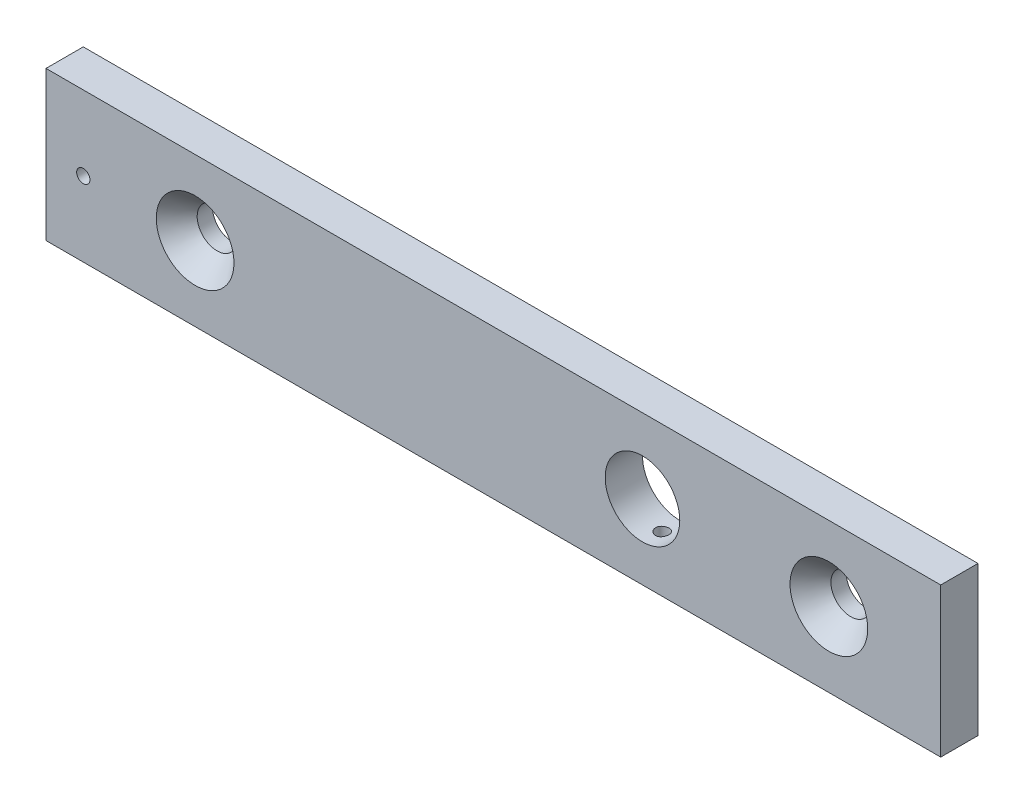
ISO-10303-21;
HEADER;
FILE_DESCRIPTION(('STEP AP214'),'2;1');
FILE_NAME('part.step','',(''),(''),'','','');
FILE_SCHEMA(('AUTOMOTIVE_DESIGN { 1 0 10303 214 1 1 1 1 }'));
ENDSEC;
DATA;
#1=APPLICATION_CONTEXT('core data for automotive mechanical design processes');
#2=APPLICATION_PROTOCOL_DEFINITION('international standard','automotive_design',2000,#1);
#3=PRODUCT_CONTEXT('',#1,'mechanical');
#4=PRODUCT('Part','Part','',(#3));
#5=PRODUCT_RELATED_PRODUCT_CATEGORY('part','',(#4));
#6=PRODUCT_DEFINITION_FORMATION('','',#4);
#7=PRODUCT_DEFINITION_CONTEXT('part definition',#1,'design');
#8=PRODUCT_DEFINITION('design','',#6,#7);
#9=PRODUCT_DEFINITION_SHAPE('','',#8);
#10=(LENGTH_UNIT() NAMED_UNIT(*) SI_UNIT(.MILLI.,.METRE.));
#11=(NAMED_UNIT(*) PLANE_ANGLE_UNIT() SI_UNIT($,.RADIAN.));
#12=(NAMED_UNIT(*) SI_UNIT($,.STERADIAN.) SOLID_ANGLE_UNIT());
#13=UNCERTAINTY_MEASURE_WITH_UNIT(LENGTH_MEASURE(1.E-05),#10,'distance_accuracy_value','');
#14=(GEOMETRIC_REPRESENTATION_CONTEXT(3) GLOBAL_UNCERTAINTY_ASSIGNED_CONTEXT((#13)) GLOBAL_UNIT_ASSIGNED_CONTEXT((#10,
#11,#12)) REPRESENTATION_CONTEXT('',''));
#15=CARTESIAN_POINT('',(0.,0.,0.));
#16=DIRECTION('',(0.,0.,1.));
#17=DIRECTION('',(1.,0.,0.));
#18=AXIS2_PLACEMENT_3D('',#15,#16,#17);
#19=CARTESIAN_POINT('',(-76.2,12.7,6.35));
#20=DIRECTION('',(1.,0.,0.));
#21=DIRECTION('',(0.,0.,-1.));
#22=AXIS2_PLACEMENT_3D('',#19,#20,#21);
#23=PLANE('',#22);
#24=DIRECTION('',(0.,-1.,0.));
#25=VECTOR('',#24,1.);
#26=CARTESIAN_POINT('',(-76.2,12.7,0.));
#27=LINE('',#26,#25);
#28=CARTESIAN_POINT('',(-76.2,12.7,0.));
#29=VERTEX_POINT('',#28);
#30=CARTESIAN_POINT('',(-76.2,-12.7,0.));
#31=VERTEX_POINT('',#30);
#32=EDGE_CURVE('E99',#29,#31,#27,.T.);
#33=ORIENTED_EDGE('',*,*,#32,.T.);
#34=DIRECTION('',(0.,0.,-1.));
#35=VECTOR('',#34,1.);
#36=CARTESIAN_POINT('',(-76.2,-12.7,6.35));
#37=LINE('',#36,#35);
#38=CARTESIAN_POINT('',(-76.2,-12.7,6.35));
#39=VERTEX_POINT('',#38);
#40=EDGE_CURVE('E11',#39,#31,#37,.T.);
#41=ORIENTED_EDGE('',*,*,#40,.F.);
#42=DIRECTION('',(0.,-1.,0.));
#43=VECTOR('',#42,1.);
#44=CARTESIAN_POINT('',(-76.2,12.7,6.35));
#45=LINE('',#44,#43);
#46=CARTESIAN_POINT('',(-76.2,12.7,6.35));
#47=VERTEX_POINT('',#46);
#48=EDGE_CURVE('E110',#47,#39,#45,.T.);
#49=ORIENTED_EDGE('',*,*,#48,.F.);
#50=DIRECTION('',(0.,0.,-1.));
#51=VECTOR('',#50,1.);
#52=CARTESIAN_POINT('',(-76.2,12.7,6.35));
#53=LINE('',#52,#51);
#54=EDGE_CURVE('E115',#47,#29,#53,.T.);
#55=ORIENTED_EDGE('',*,*,#54,.T.);
#56=EDGE_LOOP('',(#33,#41,#49,#55));
#57=FACE_BOUND('',#56,.T.);
#58=ADVANCED_FACE('F33',(#57),#23,.F.);
#59=CARTESIAN_POINT('',(-76.2,-12.7,6.35));
#60=DIRECTION('',(0.,1.,0.));
#61=DIRECTION('',(0.,0.,1.));
#62=AXIS2_PLACEMENT_3D('',#59,#60,#61);
#63=PLANE('',#62);
#64=CARTESIAN_POINT('',(25.6106696622072,-12.7,3.17891845136241));
#65=DIRECTION('',(0.,-1.,0.));
#66=DIRECTION('',(0.,0.,-1.));
#67=AXIS2_PLACEMENT_3D('',#64,#65,#66);
#68=CIRCLE('',#67,1.13029999999999);
#69=CARTESIAN_POINT('',(25.6106696622072,-12.7,2.04861845136242));
#70=VERTEX_POINT('',#69);
#71=EDGE_CURVE('E152',#70,#70,#68,.T.);
#72=ORIENTED_EDGE('',*,*,#71,.F.);
#73=EDGE_LOOP('',(#72));
#74=FACE_BOUND('',#73,.T.);
#75=DIRECTION('',(1.,0.,0.));
#76=VECTOR('',#75,1.);
#77=CARTESIAN_POINT('',(-76.2,-12.7,0.));
#78=LINE('',#77,#76);
#79=CARTESIAN_POINT('',(76.2,-12.7,0.));
#80=VERTEX_POINT('',#79);
#81=EDGE_CURVE('E103',#31,#80,#78,.T.);
#82=ORIENTED_EDGE('',*,*,#81,.T.);
#83=DIRECTION('',(0.,0.,-1.));
#84=VECTOR('',#83,1.);
#85=CARTESIAN_POINT('',(76.2,-12.7,6.35));
#86=LINE('',#85,#84);
#87=CARTESIAN_POINT('',(76.2,-12.7,6.35));
#88=VERTEX_POINT('',#87);
#89=EDGE_CURVE('E46',#88,#80,#86,.T.);
#90=ORIENTED_EDGE('',*,*,#89,.F.);
#91=DIRECTION('',(1.,0.,0.));
#92=VECTOR('',#91,1.);
#93=CARTESIAN_POINT('',(-76.2,-12.7,6.35));
#94=LINE('',#93,#92);
#95=EDGE_CURVE('E85',#39,#88,#94,.T.);
#96=ORIENTED_EDGE('',*,*,#95,.F.);
#97=ORIENTED_EDGE('',*,*,#40,.T.);
#98=EDGE_LOOP('',(#82,#90,#96,#97));
#99=FACE_BOUND('',#98,.T.);
#100=ADVANCED_FACE('F140',(#74,#99),#63,.F.);
#101=CARTESIAN_POINT('',(76.2,12.7,6.35));
#102=DIRECTION('',(-1.,0.,0.));
#103=DIRECTION('',(0.,0.,1.));
#104=AXIS2_PLACEMENT_3D('',#101,#102,#103);
#105=PLANE('',#104);
#106=DIRECTION('',(0.,1.,0.));
#107=VECTOR('',#106,1.);
#108=CARTESIAN_POINT('',(76.2,12.7,0.));
#109=LINE('',#108,#107);
#110=CARTESIAN_POINT('',(76.2,12.7,0.));
#111=VERTEX_POINT('',#110);
#112=EDGE_CURVE('E72',#80,#111,#109,.T.);
#113=ORIENTED_EDGE('',*,*,#112,.T.);
#114=DIRECTION('',(0.,0.,-1.));
#115=VECTOR('',#114,1.);
#116=CARTESIAN_POINT('',(76.2,12.7,6.35));
#117=LINE('',#116,#115);
#118=CARTESIAN_POINT('',(76.2,12.7,6.35));
#119=VERTEX_POINT('',#118);
#120=EDGE_CURVE('E121',#119,#111,#117,.T.);
#121=ORIENTED_EDGE('',*,*,#120,.F.);
#122=DIRECTION('',(0.,1.,0.));
#123=VECTOR('',#122,1.);
#124=CARTESIAN_POINT('',(76.2,12.7,6.35));
#125=LINE('',#124,#123);
#126=EDGE_CURVE('E113',#88,#119,#125,.T.);
#127=ORIENTED_EDGE('',*,*,#126,.F.);
#128=ORIENTED_EDGE('',*,*,#89,.T.);
#129=EDGE_LOOP('',(#113,#121,#127,#128));
#130=FACE_BOUND('',#129,.T.);
#131=ADVANCED_FACE('F124',(#130),#105,.F.);
#132=CARTESIAN_POINT('',(-76.2,12.7,6.35));
#133=DIRECTION('',(0.,-1.,0.));
#134=DIRECTION('',(0.,0.,-1.));
#135=AXIS2_PLACEMENT_3D('',#132,#133,#134);
#136=PLANE('',#135);
#137=DIRECTION('',(-1.,0.,0.));
#138=VECTOR('',#137,1.);
#139=CARTESIAN_POINT('',(-76.2,12.7,0.));
#140=LINE('',#139,#138);
#141=EDGE_CURVE('E78',#111,#29,#140,.T.);
#142=ORIENTED_EDGE('',*,*,#141,.T.);
#143=ORIENTED_EDGE('',*,*,#54,.F.);
#144=DIRECTION('',(-1.,0.,0.));
#145=VECTOR('',#144,1.);
#146=CARTESIAN_POINT('',(-76.2,12.7,6.35));
#147=LINE('',#146,#145);
#148=EDGE_CURVE('E54',#119,#47,#147,.T.);
#149=ORIENTED_EDGE('',*,*,#148,.F.);
#150=ORIENTED_EDGE('',*,*,#120,.T.);
#151=EDGE_LOOP('',(#142,#143,#149,#150));
#152=FACE_BOUND('',#151,.T.);
#153=ADVANCED_FACE('F130',(#152),#136,.F.);
#154=CARTESIAN_POINT('',(-76.2,-12.7,6.35));
#155=DIRECTION('',(0.,0.,1.));
#156=DIRECTION('',(1.,0.,0.));
#157=AXIS2_PLACEMENT_3D('',#154,#155,#156);
#158=PLANE('',#157);
#159=CARTESIAN_POINT('',(57.15,0.,6.35));
#160=DIRECTION('',(0.,0.,1.));
#161=DIRECTION('',(1.,0.,0.));
#162=AXIS2_PLACEMENT_3D('',#159,#160,#161);
#163=CIRCLE('',#162,6.61924);
#164=CARTESIAN_POINT('',(63.76924,0.,6.35));
#165=VERTEX_POINT('',#164);
#166=EDGE_CURVE('E209',#165,#165,#163,.T.);
#167=ORIENTED_EDGE('',*,*,#166,.F.);
#168=EDGE_LOOP('',(#167));
#169=FACE_BOUND('',#168,.T.);
#170=CARTESIAN_POINT('',(-50.8,0.,6.35));
#171=DIRECTION('',(0.,0.,1.));
#172=DIRECTION('',(1.,0.,0.));
#173=AXIS2_PLACEMENT_3D('',#170,#171,#172);
#174=CIRCLE('',#173,6.61924);
#175=CARTESIAN_POINT('',(-44.18076,0.,6.35));
#176=VERTEX_POINT('',#175);
#177=EDGE_CURVE('E201',#176,#176,#174,.T.);
#178=ORIENTED_EDGE('',*,*,#177,.F.);
#179=EDGE_LOOP('',(#178));
#180=FACE_BOUND('',#179,.T.);
#181=CARTESIAN_POINT('',(25.4,0.,6.35));
#182=DIRECTION('',(0.,0.,1.));
#183=DIRECTION('',(1.,0.,0.));
#184=AXIS2_PLACEMENT_3D('',#181,#182,#183);
#185=CIRCLE('',#184,6.34999999999999);
#186=CARTESIAN_POINT('',(31.75,0.,6.35));
#187=VERTEX_POINT('',#186);
#188=EDGE_CURVE('E157',#187,#187,#185,.T.);
#189=ORIENTED_EDGE('',*,*,#188,.F.);
#190=EDGE_LOOP('',(#189));
#191=FACE_BOUND('',#190,.T.);
#192=CARTESIAN_POINT('',(-69.85,0.,6.35));
#193=DIRECTION('',(0.,0.,1.));
#194=DIRECTION('',(1.,0.,0.));
#195=AXIS2_PLACEMENT_3D('',#192,#193,#194);
#196=CIRCLE('',#195,1.13029999999999);
#197=CARTESIAN_POINT('',(-68.7197,0.,6.35));
#198=VERTEX_POINT('',#197);
#199=EDGE_CURVE('E100',#198,#198,#196,.T.);
#200=ORIENTED_EDGE('',*,*,#199,.F.);
#201=EDGE_LOOP('',(#200));
#202=FACE_BOUND('',#201,.T.);
#203=ORIENTED_EDGE('',*,*,#48,.T.);
#204=ORIENTED_EDGE('',*,*,#95,.T.);
#205=ORIENTED_EDGE('',*,*,#126,.T.);
#206=ORIENTED_EDGE('',*,*,#148,.T.);
#207=EDGE_LOOP('',(#203,#204,#205,#206));
#208=FACE_BOUND('',#207,.T.);
#209=ADVANCED_FACE('F132',(#169,#180,#191,#202,#208),#158,.T.);
#210=CARTESIAN_POINT('',(-76.2,-12.7,0.));
#211=DIRECTION('',(0.,0.,1.));
#212=DIRECTION('',(1.,0.,0.));
#213=AXIS2_PLACEMENT_3D('',#210,#211,#212);
#214=PLANE('',#213);
#215=CARTESIAN_POINT('',(57.15,0.,0.));
#216=DIRECTION('',(0.,0.,1.));
#217=DIRECTION('',(1.,0.,0.));
#218=AXIS2_PLACEMENT_3D('',#215,#216,#217);
#219=CIRCLE('',#218,3.37819999999998);
#220=CARTESIAN_POINT('',(60.5282,0.,0.));
#221=VERTEX_POINT('',#220);
#222=EDGE_CURVE('E190',#221,#221,#219,.T.);
#223=ORIENTED_EDGE('',*,*,#222,.T.);
#224=EDGE_LOOP('',(#223));
#225=FACE_BOUND('',#224,.T.);
#226=CARTESIAN_POINT('',(-50.8,0.,0.));
#227=DIRECTION('',(0.,0.,1.));
#228=DIRECTION('',(1.,0.,0.));
#229=AXIS2_PLACEMENT_3D('',#226,#227,#228);
#230=CIRCLE('',#229,3.37819999999998);
#231=CARTESIAN_POINT('',(-47.4218,0.,0.));
#232=VERTEX_POINT('',#231);
#233=EDGE_CURVE('E154',#232,#232,#230,.T.);
#234=ORIENTED_EDGE('',*,*,#233,.T.);
#235=EDGE_LOOP('',(#234));
#236=FACE_BOUND('',#235,.T.);
#237=CARTESIAN_POINT('',(25.4,0.,0.));
#238=DIRECTION('',(0.,0.,1.));
#239=DIRECTION('',(1.,0.,0.));
#240=AXIS2_PLACEMENT_3D('',#237,#238,#239);
#241=CIRCLE('',#240,6.34999999999999);
#242=CARTESIAN_POINT('',(31.75,0.,0.));
#243=VERTEX_POINT('',#242);
#244=EDGE_CURVE('E106',#243,#243,#241,.T.);
#245=ORIENTED_EDGE('',*,*,#244,.T.);
#246=EDGE_LOOP('',(#245));
#247=FACE_BOUND('',#246,.T.);
#248=ORIENTED_EDGE('',*,*,#32,.F.);
#249=ORIENTED_EDGE('',*,*,#141,.F.);
#250=ORIENTED_EDGE('',*,*,#112,.F.);
#251=ORIENTED_EDGE('',*,*,#81,.F.);
#252=EDGE_LOOP('',(#248,#249,#250,#251));
#253=FACE_BOUND('',#252,.T.);
#254=ADVANCED_FACE('F93',(#225,#236,#247,#253),#214,.F.);
#255=CARTESIAN_POINT('',(-69.85,0.,3.048));
#256=DIRECTION('',(0.,0.,1.));
#257=DIRECTION('',(1.,0.,0.));
#258=AXIS2_PLACEMENT_3D('',#255,#256,#257);
#259=CONICAL_SURFACE('',#258,1.1303,1.02974425867665);
#260=CARTESIAN_POINT('',(-69.85,0.,2.36884724231315));
#261=VERTEX_POINT('',#260);
#262=VERTEX_LOOP('',#261);
#263=FACE_BOUND('',#262,.T.);
#264=CARTESIAN_POINT('',(-69.85,0.,3.048));
#265=DIRECTION('',(0.,0.,1.));
#266=DIRECTION('',(1.,0.,0.));
#267=AXIS2_PLACEMENT_3D('',#264,#265,#266);
#268=CIRCLE('',#267,1.1303);
#269=CARTESIAN_POINT('',(-68.7197,0.,3.048));
#270=VERTEX_POINT('',#269);
#271=EDGE_CURVE('E97',#270,#270,#268,.T.);
#272=ORIENTED_EDGE('',*,*,#271,.T.);
#273=EDGE_LOOP('',(#272));
#274=FACE_BOUND('',#273,.T.);
#275=ADVANCED_FACE('F89',(#263,#274),#259,.F.);
#276=CARTESIAN_POINT('',(-69.85,0.,6.35));
#277=DIRECTION('',(0.,0.,1.));
#278=DIRECTION('',(1.,0.,0.));
#279=AXIS2_PLACEMENT_3D('',#276,#277,#278);
#280=CYLINDRICAL_SURFACE('',#279,1.13029999999999);
#281=ORIENTED_EDGE('',*,*,#271,.F.);
#282=EDGE_LOOP('',(#281));
#283=FACE_BOUND('',#282,.T.);
#284=ORIENTED_EDGE('',*,*,#199,.T.);
#285=EDGE_LOOP('',(#284));
#286=FACE_BOUND('',#285,.T.);
#287=ADVANCED_FACE('F92',(#283,#286),#280,.F.);
#288=CARTESIAN_POINT('',(25.4,0.,6.35));
#289=DIRECTION('',(0.,0.,1.));
#290=DIRECTION('',(1.,0.,0.));
#291=AXIS2_PLACEMENT_3D('',#288,#289,#290);
#292=CYLINDRICAL_SURFACE('',#291,6.34999999999999);
#293=CARTESIAN_POINT('',(25.6106696622072,-6.34650441530024,2.04861845136241));
#294=CARTESIAN_POINT('',(25.6738785277906,-6.344405055994,2.04862099162074));
#295=CARTESIAN_POINT('',(25.737090022874,-6.34135270718955,2.05393869525095));
#296=CARTESIAN_POINT('',(25.8616713782382,-6.33350351462914,2.0750274289564));
#297=CARTESIAN_POINT('',(25.9230394375055,-6.3287050213109,2.09080835514211));
#298=CARTESIAN_POINT('',(26.0421174426985,-6.31773358589884,2.13230425396712));
#299=CARTESIAN_POINT('',(26.0998310487674,-6.31156204788083,2.15800909801105));
#300=CARTESIAN_POINT('',(26.2100988452904,-6.29835911421098,2.21859512491636));
#301=CARTESIAN_POINT('',(26.262653559053,-6.29132780593545,2.25347537571814));
#302=CARTESIAN_POINT('',(26.3618060144809,-6.27693968372534,2.33191506413502));
#303=CARTESIAN_POINT('',(26.4083264863607,-6.26958001542415,2.37557168788054));
#304=CARTESIAN_POINT('',(26.4934090840622,-6.25530352076291,2.47012077186851));
#305=CARTESIAN_POINT('',(26.5319707184269,-6.24838672176817,2.52101367862287));
#306=CARTESIAN_POINT('',(26.6001939952333,-6.23564338925816,2.62890817388581));
#307=CARTESIAN_POINT('',(26.6298146451743,-6.22982192215257,2.68593631964709));
#308=CARTESIAN_POINT('',(26.6790119558374,-6.21990856053855,2.80431241444411));
#309=CARTESIAN_POINT('',(26.698589834975,-6.21581645622987,2.86565983842607));
#310=CARTESIAN_POINT('',(26.726831210299,-6.20984909238788,2.98984523398234));
#311=CARTESIAN_POINT('',(26.7356710273067,-6.20793805199261,3.05264137286718));
#312=CARTESIAN_POINT('',(26.742734927237,-6.20641418872394,3.17885239649324));
#313=CARTESIAN_POINT('',(26.7409601554929,-6.20680111789544,3.24226721374077));
#314=CARTESIAN_POINT('',(26.7269692768302,-6.2098068177659,3.36685879230542));
#315=CARTESIAN_POINT('',(26.7149184434739,-6.21239025925713,3.42805508083911));
#316=CARTESIAN_POINT('',(26.6809765377869,-6.2194772293041,3.54753586301441));
#317=CARTESIAN_POINT('',(26.6590850149924,-6.22398084575656,3.60582022322496));
#318=CARTESIAN_POINT('',(26.6059197545531,-6.23450026031803,3.71832104450403));
#319=CARTESIAN_POINT('',(26.5745775845147,-6.2405270343133,3.77250410105451));
#320=CARTESIAN_POINT('',(26.5034606657763,-6.25349320464103,3.87489918573259));
#321=CARTESIAN_POINT('',(26.4636848947382,-6.26043271157805,3.92311048882875));
#322=CARTESIAN_POINT('',(26.3758928068966,-6.27472278804852,4.01321254256594));
#323=CARTESIAN_POINT('',(26.3277270245342,-6.28207881432759,4.05495689608472));
#324=CARTESIAN_POINT('',(26.2250332615857,-6.29638815824485,4.12979833616421));
#325=CARTESIAN_POINT('',(26.1705050161538,-6.30334145910102,4.16289506257015));
#326=CARTESIAN_POINT('',(26.0562380277132,-6.31626251030318,4.21965807771963));
#327=CARTESIAN_POINT('',(25.9964714975679,-6.32222444981598,4.24326983903632));
#328=CARTESIAN_POINT('',(25.8736814863018,-6.33260753612663,4.28005850802719));
#329=CARTESIAN_POINT('',(25.810658319913,-6.33702883149884,4.29323642206118));
#330=CARTESIAN_POINT('',(25.6840780213232,-6.34395465638698,4.30860743934202));
#331=CARTESIAN_POINT('',(25.6205406088107,-6.34648506939797,4.31095124588329));
#332=CARTESIAN_POINT('',(25.4939257382089,-6.3496210626679,4.30495796011213));
#333=CARTESIAN_POINT('',(25.4308482468947,-6.35022678336996,4.29662164718106));
#334=CARTESIAN_POINT('',(25.3077272420466,-6.34962469175683,4.26966538757982));
#335=CARTESIAN_POINT('',(25.247656658765,-6.34843825508937,4.2511682997827));
#336=CARTESIAN_POINT('',(25.1314449082057,-6.34458520309912,4.20451223866928));
#337=CARTESIAN_POINT('',(25.0753038785274,-6.34191853597287,4.17635292721836));
#338=CARTESIAN_POINT('',(24.9682061142564,-6.33553085239145,4.11099959890393));
#339=CARTESIAN_POINT('',(24.9172788483751,-6.33180424918631,4.07375786243951));
#340=CARTESIAN_POINT('',(24.8223348300659,-6.3238498568375,3.99135800698956));
#341=CARTESIAN_POINT('',(24.7783185901249,-6.31962203056639,3.9461993014464));
#342=CARTESIAN_POINT('',(24.6979304159734,-6.31120073035877,3.84863887113776));
#343=CARTESIAN_POINT('',(24.6616518204606,-6.30700820465306,3.79616010497504));
#344=CARTESIAN_POINT('',(24.5984071210784,-6.29928314293491,3.68581718922824));
#345=CARTESIAN_POINT('',(24.5714409269473,-6.29575060052567,3.62795309184904));
#346=CARTESIAN_POINT('',(24.527614787685,-6.28982799304933,3.50848810115558));
#347=CARTESIAN_POINT('',(24.5107502247671,-6.28743740605835,3.44688892946985));
#348=CARTESIAN_POINT('',(24.4876182566411,-6.2841227151245,3.32169484326322));
#349=CARTESIAN_POINT('',(24.4813501371105,-6.28319851233067,3.25810006356374));
#350=CARTESIAN_POINT('',(24.4796104641219,-6.28294385898931,3.13137153505844));
#351=CARTESIAN_POINT('',(24.4840360519928,-6.283598224697,3.06823920627763));
#352=CARTESIAN_POINT('',(24.5033344848712,-6.28638086984317,2.9436268649422));
#353=CARTESIAN_POINT('',(24.5182073346674,-6.28850914995727,2.88214685314499));
#354=CARTESIAN_POINT('',(24.5579368204346,-6.29395169969965,2.7626332152056));
#355=CARTESIAN_POINT('',(24.5827829902568,-6.29726472564177,2.70459604914571));
#356=CARTESIAN_POINT('',(24.64174727497,-6.3046357310241,2.59349279805672));
#357=CARTESIAN_POINT('',(24.6758657626688,-6.3086937404154,2.54042691302098));
#358=CARTESIAN_POINT('',(24.7527880014893,-6.31705018029605,2.44024217731042));
#359=CARTESIAN_POINT('',(24.7956695523703,-6.32135049526784,2.3931832045322));
#360=CARTESIAN_POINT('',(24.8887443158963,-6.32955728168244,2.30689240590758));
#361=CARTESIAN_POINT('',(24.9389389870537,-6.33346367429865,2.26766214510919));
#362=CARTESIAN_POINT('',(25.045412851271,-6.34031705952874,2.19803988742838));
#363=CARTESIAN_POINT('',(25.1017109936882,-6.34326094327715,2.16767656348054));
#364=CARTESIAN_POINT('',(25.2186313088308,-6.34767789204534,2.11687388080957));
#365=CARTESIAN_POINT('',(25.2792491532633,-6.34915240775536,2.09642474418815));
#366=CARTESIAN_POINT('',(25.3851964142966,-6.35013635886429,2.07040447336709));
#367=CARTESIAN_POINT('',(25.4299041425734,-6.35008925705173,2.06224510281943));
#368=CARTESIAN_POINT('',(25.5199640233526,-6.34902644180319,2.05135122231324));
#369=CARTESIAN_POINT('',(25.5653161659045,-6.34801074330748,2.04861662868144));
#370=CARTESIAN_POINT('',(25.6106696622072,-6.34650441530024,2.04861845136241));
#371=B_SPLINE_CURVE_WITH_KNOTS('',3,(#293,#294,#295,#296,#297,#298,#299,#300,#301,#302,#303,
#304,#305,#306,#307,#308,#309,#310,#311,#312,#313,#314,#315,#316,#317,#318,#319,#320,#321,#322,
#323,#324,#325,#326,#327,#328,#329,#330,#331,#332,#333,#334,#335,#336,#337,#338,#339,#340,#341,
#342,#343,#344,#345,#346,#347,#348,#349,#350,#351,#352,#353,#354,#355,#356,#357,#358,#359,#360,
#361,#362,#363,#364,#365,#366,#367,#368,#369,#370),.UNSPECIFIED.,.T.,.F.,(4,2,2,2,2,2,2,2,2,2,2,
2,2,2,2,2,2,2,2,2,2,2,2,2,2,2,2,2,2,2,2,2,2,2,2,2,2,2,4),(0.,0.189564241207756,
0.379308028418909,0.568858668222385,0.758390060452669,0.950148961160598,1.14191969941268,
1.33455675842526,1.52717044066944,1.71657665889669,1.90596244021998,2.09235849864961,
2.27876309034443,2.46655124922125,2.65436218518465,2.84594530466553,3.0375364018932,
3.2302136803928,3.42287237262277,3.61284293826611,3.80279964160367,3.99050848966542,
4.17822390736724,4.36694768490585,4.55568545064971,4.74658515287213,4.93748300472355,
5.12829352417798,5.3190911802874,5.50806094421472,5.69703079476262,5.88580285386183,
6.07458250395443,6.26511728229742,6.45569011262221,6.64687254059303,6.83786602877637,
6.97388387445669,7.10989962214334),.UNSPECIFIED.);
#372=CARTESIAN_POINT('',(25.6106696622072,-6.34650441530024,2.04861845136241));
#373=VERTEX_POINT('',#372);
#374=EDGE_CURVE('E36',#373,#373,#371,.T.);
#375=ORIENTED_EDGE('',*,*,#374,.T.);
#376=EDGE_LOOP('',(#375));
#377=FACE_BOUND('',#376,.T.);
#378=ORIENTED_EDGE('',*,*,#244,.F.);
#379=EDGE_LOOP('',(#378));
#380=FACE_BOUND('',#379,.T.);
#381=ORIENTED_EDGE('',*,*,#188,.T.);
#382=EDGE_LOOP('',(#381));
#383=FACE_BOUND('',#382,.T.);
#384=ADVANCED_FACE('F168',(#377,#380,#383),#292,.F.);
#385=CARTESIAN_POINT('',(25.6106696622072,-12.7,3.17891845136241));
#386=DIRECTION('',(0.,-1.,0.));
#387=DIRECTION('',(0.,0.,-1.));
#388=AXIS2_PLACEMENT_3D('',#385,#386,#387);
#389=CYLINDRICAL_SURFACE('',#388,1.13029999999999);
#390=ORIENTED_EDGE('',*,*,#71,.T.);
#391=EDGE_LOOP('',(#390));
#392=FACE_BOUND('',#391,.T.);
#393=ORIENTED_EDGE('',*,*,#374,.F.);
#394=EDGE_LOOP('',(#393));
#395=FACE_BOUND('',#394,.T.);
#396=ADVANCED_FACE('F171',(#392,#395),#389,.F.);
#397=CARTESIAN_POINT('',(-50.8,0.,6.35));
#398=DIRECTION('',(0.,0.,1.));
#399=DIRECTION('',(1.,0.,0.));
#400=AXIS2_PLACEMENT_3D('',#397,#398,#399);
#401=CYLINDRICAL_SURFACE('',#400,3.37819999999999);
#402=ORIENTED_EDGE('',*,*,#233,.F.);
#403=EDGE_LOOP('',(#402));
#404=FACE_BOUND('',#403,.T.);
#405=CARTESIAN_POINT('',(-50.8,0.,2.62160997746041));
#406=DIRECTION('',(0.,0.,1.));
#407=DIRECTION('',(1.,0.,0.));
#408=AXIS2_PLACEMENT_3D('',#405,#406,#407);
#409=CIRCLE('',#408,3.37819999999999);
#410=CARTESIAN_POINT('',(-47.4218,0.,2.62160997746041));
#411=VERTEX_POINT('',#410);
#412=EDGE_CURVE('E159',#411,#411,#409,.T.);
#413=ORIENTED_EDGE('',*,*,#412,.T.);
#414=EDGE_LOOP('',(#413));
#415=FACE_BOUND('',#414,.T.);
#416=ADVANCED_FACE('F193',(#404,#415),#401,.F.);
#417=CARTESIAN_POINT('',(-50.8,0.,6.35));
#418=DIRECTION('',(0.,0.,1.));
#419=DIRECTION('',(1.,0.,0.));
#420=AXIS2_PLACEMENT_3D('',#417,#418,#419);
#421=CONICAL_SURFACE('',#420,6.61924,0.715584993317675);
#422=ORIENTED_EDGE('',*,*,#412,.F.);
#423=EDGE_LOOP('',(#422));
#424=FACE_BOUND('',#423,.T.);
#425=ORIENTED_EDGE('',*,*,#177,.T.);
#426=EDGE_LOOP('',(#425));
#427=FACE_BOUND('',#426,.T.);
#428=ADVANCED_FACE('F196',(#424,#427),#421,.F.);
#429=CARTESIAN_POINT('',(57.15,0.,6.35));
#430=DIRECTION('',(0.,0.,1.));
#431=DIRECTION('',(1.,0.,0.));
#432=AXIS2_PLACEMENT_3D('',#429,#430,#431);
#433=CYLINDRICAL_SURFACE('',#432,3.37819999999998);
#434=ORIENTED_EDGE('',*,*,#222,.F.);
#435=EDGE_LOOP('',(#434));
#436=FACE_BOUND('',#435,.T.);
#437=CARTESIAN_POINT('',(57.15,0.,2.62160997746041));
#438=DIRECTION('',(0.,0.,1.));
#439=DIRECTION('',(1.,0.,0.));
#440=AXIS2_PLACEMENT_3D('',#437,#438,#439);
#441=CIRCLE('',#440,3.37819999999998);
#442=CARTESIAN_POINT('',(60.5282,0.,2.62160997746041));
#443=VERTEX_POINT('',#442);
#444=EDGE_CURVE('E206',#443,#443,#441,.T.);
#445=ORIENTED_EDGE('',*,*,#444,.T.);
#446=EDGE_LOOP('',(#445));
#447=FACE_BOUND('',#446,.T.);
#448=ADVANCED_FACE('F218',(#436,#447),#433,.F.);
#449=CARTESIAN_POINT('',(57.15,0.,6.35));
#450=DIRECTION('',(0.,0.,1.));
#451=DIRECTION('',(1.,0.,0.));
#452=AXIS2_PLACEMENT_3D('',#449,#450,#451);
#453=CONICAL_SURFACE('',#452,6.61924,0.715584993317676);
#454=ORIENTED_EDGE('',*,*,#444,.F.);
#455=EDGE_LOOP('',(#454));
#456=FACE_BOUND('',#455,.T.);
#457=ORIENTED_EDGE('',*,*,#166,.T.);
#458=EDGE_LOOP('',(#457));
#459=FACE_BOUND('',#458,.T.);
#460=ADVANCED_FACE('F213',(#456,#459),#453,.F.);
#461=CLOSED_SHELL('',(#58,#100,#131,#153,#209,#254,#275,#287,#384,#396,#416,#428,#448,#460));
#462=MANIFOLD_SOLID_BREP('B2',#461);
#463=ADVANCED_BREP_SHAPE_REPRESENTATION('',(#18,#462),#14);
#464=SHAPE_DEFINITION_REPRESENTATION(#9,#463);
ENDSEC;
END-ISO-10303-21;
